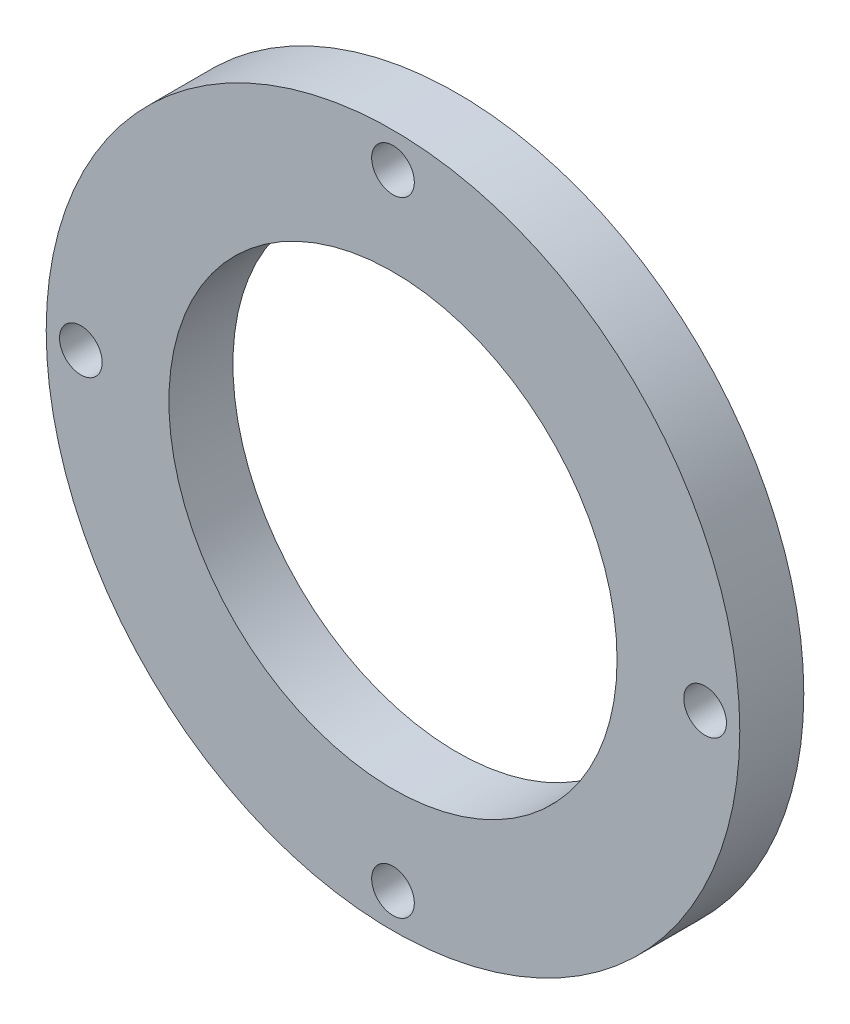
ISO-10303-21;
HEADER;
FILE_DESCRIPTION(('STEP AP214'),'2;1');
FILE_NAME('part.step','',(''),(''),'','','');
FILE_SCHEMA(('AUTOMOTIVE_DESIGN { 1 0 10303 214 1 1 1 1 }'));
ENDSEC;
DATA;
#1=APPLICATION_CONTEXT('core data for automotive mechanical design processes');
#2=APPLICATION_PROTOCOL_DEFINITION('international standard','automotive_design',2000,#1);
#3=PRODUCT_CONTEXT('',#1,'mechanical');
#4=PRODUCT('Part','Part','',(#3));
#5=PRODUCT_RELATED_PRODUCT_CATEGORY('part','',(#4));
#6=PRODUCT_DEFINITION_FORMATION('','',#4);
#7=PRODUCT_DEFINITION_CONTEXT('part definition',#1,'design');
#8=PRODUCT_DEFINITION('design','',#6,#7);
#9=PRODUCT_DEFINITION_SHAPE('','',#8);
#10=(LENGTH_UNIT() NAMED_UNIT(*) SI_UNIT(.MILLI.,.METRE.));
#11=(NAMED_UNIT(*) PLANE_ANGLE_UNIT() SI_UNIT($,.RADIAN.));
#12=(NAMED_UNIT(*) SI_UNIT($,.STERADIAN.) SOLID_ANGLE_UNIT());
#13=UNCERTAINTY_MEASURE_WITH_UNIT(LENGTH_MEASURE(1.E-05),#10,'distance_accuracy_value','');
#14=(GEOMETRIC_REPRESENTATION_CONTEXT(3) GLOBAL_UNCERTAINTY_ASSIGNED_CONTEXT((#13)) GLOBAL_UNIT_ASSIGNED_CONTEXT((#10,
#11,#12)) REPRESENTATION_CONTEXT('',''));
#15=CARTESIAN_POINT('',(0.,0.,0.));
#16=DIRECTION('',(0.,0.,1.));
#17=DIRECTION('',(1.,0.,0.));
#18=AXIS2_PLACEMENT_3D('',#15,#16,#17);
#19=CARTESIAN_POINT('',(0.,0.,6.));
#20=DIRECTION('',(0.,0.,1.));
#21=DIRECTION('',(1.,0.,0.));
#22=AXIS2_PLACEMENT_3D('',#19,#20,#21);
#23=PLANE('',#22);
#24=CARTESIAN_POINT('',(-1.12496817417096E-12,-29.25,6.));
#25=DIRECTION('',(0.,0.,1.));
#26=DIRECTION('',(1.,0.,0.));
#27=AXIS2_PLACEMENT_3D('',#24,#25,#26);
#28=CIRCLE('',#27,2.);
#29=CARTESIAN_POINT('',(1.99999999999888,-29.25,6.));
#30=VERTEX_POINT('',#29);
#31=EDGE_CURVE('E65',#30,#30,#28,.T.);
#32=ORIENTED_EDGE('',*,*,#31,.F.);
#33=EDGE_LOOP('',(#32));
#34=FACE_BOUND('',#33,.T.);
#35=CARTESIAN_POINT('',(1.12875725860401E-12,29.25,6.));
#36=DIRECTION('',(0.,0.,1.));
#37=DIRECTION('',(1.,0.,0.));
#38=AXIS2_PLACEMENT_3D('',#35,#36,#37);
#39=CIRCLE('',#38,2.);
#40=CARTESIAN_POINT('',(2.00000000000113,29.25,6.));
#41=VERTEX_POINT('',#40);
#42=EDGE_CURVE('E53',#41,#41,#39,.T.);
#43=ORIENTED_EDGE('',*,*,#42,.F.);
#44=EDGE_LOOP('',(#43));
#45=FACE_BOUND('',#44,.T.);
#46=CARTESIAN_POINT('',(0.,0.,6.));
#47=DIRECTION('',(0.,0.,1.));
#48=DIRECTION('',(1.,0.,0.));
#49=AXIS2_PLACEMENT_3D('',#46,#47,#48);
#50=CIRCLE('',#49,32.5);
#51=CARTESIAN_POINT('',(32.5,0.,6.));
#52=VERTEX_POINT('',#51);
#53=EDGE_CURVE('E10',#52,#52,#50,.T.);
#54=ORIENTED_EDGE('',*,*,#53,.T.);
#55=EDGE_LOOP('',(#54));
#56=FACE_BOUND('',#55,.T.);
#57=CARTESIAN_POINT('',(0.,0.,6.));
#58=DIRECTION('',(0.,0.,1.));
#59=DIRECTION('',(1.,0.,0.));
#60=AXIS2_PLACEMENT_3D('',#57,#58,#59);
#61=CIRCLE('',#60,21.);
#62=CARTESIAN_POINT('',(21.,0.,6.));
#63=VERTEX_POINT('',#62);
#64=EDGE_CURVE('E48',#63,#63,#61,.T.);
#65=ORIENTED_EDGE('',*,*,#64,.F.);
#66=EDGE_LOOP('',(#65));
#67=FACE_BOUND('',#66,.T.);
#68=CARTESIAN_POINT('',(29.25,-1.12696621266025E-12,6.));
#69=DIRECTION('',(0.,0.,1.));
#70=DIRECTION('',(1.,0.,0.));
#71=AXIS2_PLACEMENT_3D('',#68,#69,#70);
#72=CIRCLE('',#71,2.);
#73=CARTESIAN_POINT('',(31.25,-1.12696621266025E-12,6.));
#74=VERTEX_POINT('',#73);
#75=EDGE_CURVE('E59',#74,#74,#72,.T.);
#76=ORIENTED_EDGE('',*,*,#75,.F.);
#77=EDGE_LOOP('',(#76));
#78=FACE_BOUND('',#77,.T.);
#79=CARTESIAN_POINT('',(-29.25,1.13060602546788E-12,6.));
#80=DIRECTION('',(0.,0.,1.));
#81=DIRECTION('',(1.,0.,0.));
#82=AXIS2_PLACEMENT_3D('',#79,#80,#81);
#83=CIRCLE('',#82,2.);
#84=CARTESIAN_POINT('',(-27.25,1.13060602546788E-12,6.));
#85=VERTEX_POINT('',#84);
#86=EDGE_CURVE('E71',#85,#85,#83,.T.);
#87=ORIENTED_EDGE('',*,*,#86,.F.);
#88=EDGE_LOOP('',(#87));
#89=FACE_BOUND('',#88,.T.);
#90=ADVANCED_FACE('F37',(#34,#45,#56,#67,#78,#89),#23,.T.);
#91=CARTESIAN_POINT('',(0.,0.,0.));
#92=DIRECTION('',(0.,0.,1.));
#93=DIRECTION('',(1.,0.,0.));
#94=AXIS2_PLACEMENT_3D('',#91,#92,#93);
#95=PLANE('',#94);
#96=CARTESIAN_POINT('',(0.,0.,0.));
#97=DIRECTION('',(0.,0.,1.));
#98=DIRECTION('',(1.,0.,0.));
#99=AXIS2_PLACEMENT_3D('',#96,#97,#98);
#100=CIRCLE('',#99,32.5);
#101=CARTESIAN_POINT('',(32.5,0.,0.));
#102=VERTEX_POINT('',#101);
#103=EDGE_CURVE('E41',#102,#102,#100,.T.);
#104=ORIENTED_EDGE('',*,*,#103,.F.);
#105=EDGE_LOOP('',(#104));
#106=FACE_BOUND('',#105,.T.);
#107=CARTESIAN_POINT('',(0.,0.,0.));
#108=DIRECTION('',(0.,0.,1.));
#109=DIRECTION('',(1.,0.,0.));
#110=AXIS2_PLACEMENT_3D('',#107,#108,#109);
#111=CIRCLE('',#110,21.);
#112=CARTESIAN_POINT('',(21.,0.,0.));
#113=VERTEX_POINT('',#112);
#114=EDGE_CURVE('E50',#113,#113,#111,.T.);
#115=ORIENTED_EDGE('',*,*,#114,.T.);
#116=EDGE_LOOP('',(#115));
#117=FACE_BOUND('',#116,.T.);
#118=CARTESIAN_POINT('',(1.12875725860401E-12,29.25,0.));
#119=DIRECTION('',(0.,0.,1.));
#120=DIRECTION('',(1.,0.,0.));
#121=AXIS2_PLACEMENT_3D('',#118,#119,#120);
#122=CIRCLE('',#121,2.);
#123=CARTESIAN_POINT('',(2.00000000000113,29.25,0.));
#124=VERTEX_POINT('',#123);
#125=EDGE_CURVE('E56',#124,#124,#122,.T.);
#126=ORIENTED_EDGE('',*,*,#125,.T.);
#127=EDGE_LOOP('',(#126));
#128=FACE_BOUND('',#127,.T.);
#129=CARTESIAN_POINT('',(29.25,-1.12696621266025E-12,0.));
#130=DIRECTION('',(0.,0.,1.));
#131=DIRECTION('',(1.,0.,0.));
#132=AXIS2_PLACEMENT_3D('',#129,#130,#131);
#133=CIRCLE('',#132,2.);
#134=CARTESIAN_POINT('',(31.25,-1.12696621266025E-12,0.));
#135=VERTEX_POINT('',#134);
#136=EDGE_CURVE('E62',#135,#135,#133,.T.);
#137=ORIENTED_EDGE('',*,*,#136,.T.);
#138=EDGE_LOOP('',(#137));
#139=FACE_BOUND('',#138,.T.);
#140=CARTESIAN_POINT('',(-1.12496817417096E-12,-29.25,0.));
#141=DIRECTION('',(0.,0.,1.));
#142=DIRECTION('',(1.,0.,0.));
#143=AXIS2_PLACEMENT_3D('',#140,#141,#142);
#144=CIRCLE('',#143,2.);
#145=CARTESIAN_POINT('',(1.99999999999888,-29.25,0.));
#146=VERTEX_POINT('',#145);
#147=EDGE_CURVE('E68',#146,#146,#144,.T.);
#148=ORIENTED_EDGE('',*,*,#147,.T.);
#149=EDGE_LOOP('',(#148));
#150=FACE_BOUND('',#149,.T.);
#151=CARTESIAN_POINT('',(-29.25,1.13060602546788E-12,0.));
#152=DIRECTION('',(0.,0.,1.));
#153=DIRECTION('',(1.,0.,0.));
#154=AXIS2_PLACEMENT_3D('',#151,#152,#153);
#155=CIRCLE('',#154,2.);
#156=CARTESIAN_POINT('',(-27.25,1.13060602546788E-12,0.));
#157=VERTEX_POINT('',#156);
#158=EDGE_CURVE('E74',#157,#157,#155,.T.);
#159=ORIENTED_EDGE('',*,*,#158,.T.);
#160=EDGE_LOOP('',(#159));
#161=FACE_BOUND('',#160,.T.);
#162=ADVANCED_FACE('F84',(#106,#117,#128,#139,#150,#161),#95,.F.);
#163=CARTESIAN_POINT('',(0.,0.,6.));
#164=DIRECTION('',(0.,0.,-1.));
#165=DIRECTION('',(-1.,0.,0.));
#166=AXIS2_PLACEMENT_3D('',#163,#164,#165);
#167=CYLINDRICAL_SURFACE('',#166,32.5);
#168=ORIENTED_EDGE('',*,*,#53,.F.);
#169=EDGE_LOOP('',(#168));
#170=FACE_BOUND('',#169,.T.);
#171=ORIENTED_EDGE('',*,*,#103,.T.);
#172=EDGE_LOOP('',(#171));
#173=FACE_BOUND('',#172,.T.);
#174=ADVANCED_FACE('F39',(#170,#173),#167,.T.);
#175=CARTESIAN_POINT('',(0.,0.,6.));
#176=DIRECTION('',(0.,0.,-1.));
#177=DIRECTION('',(-1.,0.,0.));
#178=AXIS2_PLACEMENT_3D('',#175,#176,#177);
#179=CYLINDRICAL_SURFACE('',#178,21.);
#180=ORIENTED_EDGE('',*,*,#64,.T.);
#181=EDGE_LOOP('',(#180));
#182=FACE_BOUND('',#181,.T.);
#183=ORIENTED_EDGE('',*,*,#114,.F.);
#184=EDGE_LOOP('',(#183));
#185=FACE_BOUND('',#184,.T.);
#186=ADVANCED_FACE('F94',(#182,#185),#179,.F.);
#187=CARTESIAN_POINT('',(1.12875725860401E-12,29.25,6.));
#188=DIRECTION('',(0.,0.,-1.));
#189=DIRECTION('',(-1.,0.,0.));
#190=AXIS2_PLACEMENT_3D('',#187,#188,#189);
#191=CYLINDRICAL_SURFACE('',#190,2.);
#192=ORIENTED_EDGE('',*,*,#42,.T.);
#193=EDGE_LOOP('',(#192));
#194=FACE_BOUND('',#193,.T.);
#195=ORIENTED_EDGE('',*,*,#125,.F.);
#196=EDGE_LOOP('',(#195));
#197=FACE_BOUND('',#196,.T.);
#198=ADVANCED_FACE('F97',(#194,#197),#191,.F.);
#199=CARTESIAN_POINT('',(29.25,-1.12696621266025E-12,6.));
#200=DIRECTION('',(0.,0.,-1.));
#201=DIRECTION('',(-1.,0.,0.));
#202=AXIS2_PLACEMENT_3D('',#199,#200,#201);
#203=CYLINDRICAL_SURFACE('',#202,2.);
#204=ORIENTED_EDGE('',*,*,#75,.T.);
#205=EDGE_LOOP('',(#204));
#206=FACE_BOUND('',#205,.T.);
#207=ORIENTED_EDGE('',*,*,#136,.F.);
#208=EDGE_LOOP('',(#207));
#209=FACE_BOUND('',#208,.T.);
#210=ADVANCED_FACE('F101',(#206,#209),#203,.F.);
#211=CARTESIAN_POINT('',(-1.12496817417096E-12,-29.25,6.));
#212=DIRECTION('',(0.,0.,-1.));
#213=DIRECTION('',(-1.,0.,0.));
#214=AXIS2_PLACEMENT_3D('',#211,#212,#213);
#215=CYLINDRICAL_SURFACE('',#214,2.);
#216=ORIENTED_EDGE('',*,*,#31,.T.);
#217=EDGE_LOOP('',(#216));
#218=FACE_BOUND('',#217,.T.);
#219=ORIENTED_EDGE('',*,*,#147,.F.);
#220=EDGE_LOOP('',(#219));
#221=FACE_BOUND('',#220,.T.);
#222=ADVANCED_FACE('F105',(#218,#221),#215,.F.);
#223=CARTESIAN_POINT('',(-29.25,1.13060602546788E-12,6.));
#224=DIRECTION('',(0.,0.,-1.));
#225=DIRECTION('',(-1.,0.,0.));
#226=AXIS2_PLACEMENT_3D('',#223,#224,#225);
#227=CYLINDRICAL_SURFACE('',#226,2.);
#228=ORIENTED_EDGE('',*,*,#86,.T.);
#229=EDGE_LOOP('',(#228));
#230=FACE_BOUND('',#229,.T.);
#231=ORIENTED_EDGE('',*,*,#158,.F.);
#232=EDGE_LOOP('',(#231));
#233=FACE_BOUND('',#232,.T.);
#234=ADVANCED_FACE('F80',(#230,#233),#227,.F.);
#235=CLOSED_SHELL('',(#90,#162,#174,#186,#198,#210,#222,#234));
#236=MANIFOLD_SOLID_BREP('B2',#235);
#237=ADVANCED_BREP_SHAPE_REPRESENTATION('',(#18,#236),#14);
#238=SHAPE_DEFINITION_REPRESENTATION(#9,#237);
ENDSEC;
END-ISO-10303-21;
